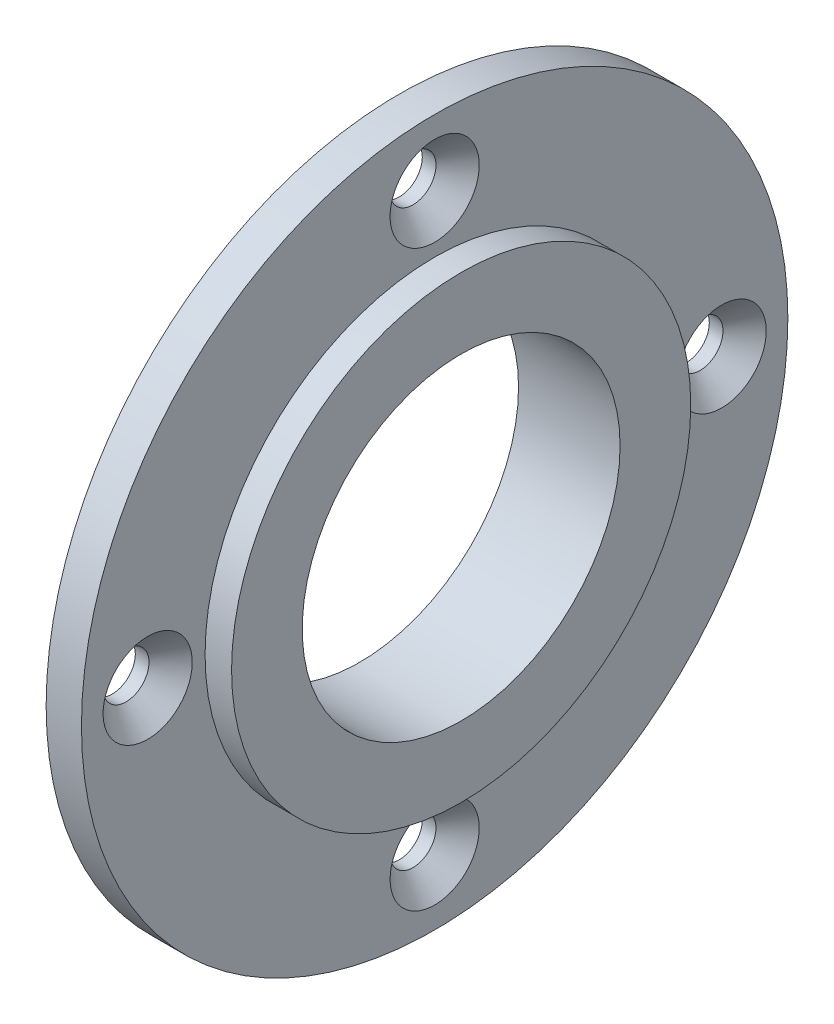
ISO-10303-21;
HEADER;
FILE_DESCRIPTION(('STEP AP214'),'2;1');
FILE_NAME('part.step','',(''),(''),'','','');
FILE_SCHEMA(('AUTOMOTIVE_DESIGN { 1 0 10303 214 1 1 1 1 }'));
ENDSEC;
DATA;
#1=APPLICATION_CONTEXT('core data for automotive mechanical design processes');
#2=APPLICATION_PROTOCOL_DEFINITION('international standard','automotive_design',2000,#1);
#3=PRODUCT_CONTEXT('',#1,'mechanical');
#4=PRODUCT('Part','Part','',(#3));
#5=PRODUCT_RELATED_PRODUCT_CATEGORY('part','',(#4));
#6=PRODUCT_DEFINITION_FORMATION('','',#4);
#7=PRODUCT_DEFINITION_CONTEXT('part definition',#1,'design');
#8=PRODUCT_DEFINITION('design','',#6,#7);
#9=PRODUCT_DEFINITION_SHAPE('','',#8);
#10=(LENGTH_UNIT() NAMED_UNIT(*) SI_UNIT(.MILLI.,.METRE.));
#11=(NAMED_UNIT(*) PLANE_ANGLE_UNIT() SI_UNIT($,.RADIAN.));
#12=(NAMED_UNIT(*) SI_UNIT($,.STERADIAN.) SOLID_ANGLE_UNIT());
#13=UNCERTAINTY_MEASURE_WITH_UNIT(LENGTH_MEASURE(1.E-05),#10,'distance_accuracy_value','');
#14=(GEOMETRIC_REPRESENTATION_CONTEXT(3) GLOBAL_UNCERTAINTY_ASSIGNED_CONTEXT((#13)) GLOBAL_UNIT_ASSIGNED_CONTEXT((#10,
#11,#12)) REPRESENTATION_CONTEXT('',''));
#15=CARTESIAN_POINT('',(0.,0.,0.));
#16=DIRECTION('',(0.,0.,1.));
#17=DIRECTION('',(1.,0.,0.));
#18=AXIS2_PLACEMENT_3D('',#15,#16,#17);
#19=CARTESIAN_POINT('',(-174.905599098805,18.,0.));
#20=DIRECTION('',(1.,0.,0.));
#21=DIRECTION('',(0.,0.,-1.));
#22=AXIS2_PLACEMENT_3D('',#19,#20,#21);
#23=PLANE('',#22);
#24=CARTESIAN_POINT('',(-174.905599098805,0.,0.));
#25=DIRECTION('',(1.,0.,0.));
#26=DIRECTION('',(0.,0.,-1.));
#27=AXIS2_PLACEMENT_3D('',#24,#25,#26);
#28=CIRCLE('',#27,26.);
#29=CARTESIAN_POINT('',(-174.905599098805,0.,-26.));
#30=VERTEX_POINT('',#29);
#31=EDGE_CURVE('E12',#30,#30,#28,.T.);
#32=ORIENTED_EDGE('',*,*,#31,.T.);
#33=EDGE_LOOP('',(#32));
#34=FACE_BOUND('',#33,.T.);
#35=CARTESIAN_POINT('',(-174.905599098805,0.,0.));
#36=DIRECTION('',(1.,0.,0.));
#37=DIRECTION('',(0.,0.,-1.));
#38=AXIS2_PLACEMENT_3D('',#35,#36,#37);
#39=CIRCLE('',#38,18.);
#40=CARTESIAN_POINT('',(-174.905599098805,0.,-18.));
#41=VERTEX_POINT('',#40);
#42=EDGE_CURVE('E72',#41,#41,#39,.T.);
#43=ORIENTED_EDGE('',*,*,#42,.F.);
#44=EDGE_LOOP('',(#43));
#45=FACE_BOUND('',#44,.T.);
#46=ADVANCED_FACE('F44',(#34,#45),#23,.T.);
#47=CARTESIAN_POINT('',(0.,0.,0.));
#48=DIRECTION('',(1.,0.,0.));
#49=DIRECTION('',(0.,0.,-1.));
#50=AXIS2_PLACEMENT_3D('',#47,#48,#49);
#51=CYLINDRICAL_SURFACE('',#50,26.);
#52=CARTESIAN_POINT('',(-177.905599098805,0.,0.));
#53=DIRECTION('',(1.,0.,0.));
#54=DIRECTION('',(0.,0.,-1.));
#55=AXIS2_PLACEMENT_3D('',#52,#53,#54);
#56=CIRCLE('',#55,26.);
#57=CARTESIAN_POINT('',(-177.905599098805,0.,-26.));
#58=VERTEX_POINT('',#57);
#59=EDGE_CURVE('E51',#58,#58,#56,.T.);
#60=ORIENTED_EDGE('',*,*,#59,.T.);
#61=EDGE_LOOP('',(#60));
#62=FACE_BOUND('',#61,.T.);
#63=ORIENTED_EDGE('',*,*,#31,.F.);
#64=EDGE_LOOP('',(#63));
#65=FACE_BOUND('',#64,.T.);
#66=ADVANCED_FACE('F115',(#62,#65),#51,.T.);
#67=CARTESIAN_POINT('',(-177.905599098805,26.,0.));
#68=DIRECTION('',(1.,0.,0.));
#69=DIRECTION('',(0.,0.,-1.));
#70=AXIS2_PLACEMENT_3D('',#67,#68,#69);
#71=PLANE('',#70);
#72=CARTESIAN_POINT('',(-177.905599098805,-1.13473143512402E-13,32.5));
#73=DIRECTION('',(1.,0.,0.));
#74=DIRECTION('',(0.,1.,0.));
#75=AXIS2_PLACEMENT_3D('',#72,#73,#74);
#76=CIRCLE('',#75,5.05);
#77=CARTESIAN_POINT('',(-177.905599098805,5.04999999999989,32.5));
#78=VERTEX_POINT('',#77);
#79=EDGE_CURVE('E95',#78,#78,#76,.T.);
#80=ORIENTED_EDGE('',*,*,#79,.F.);
#81=EDGE_LOOP('',(#80));
#82=FACE_BOUND('',#81,.T.);
#83=CARTESIAN_POINT('',(-177.905599098805,-32.5,0.));
#84=DIRECTION('',(1.,0.,0.));
#85=DIRECTION('',(0.,0.,1.));
#86=AXIS2_PLACEMENT_3D('',#83,#84,#85);
#87=CIRCLE('',#86,5.05);
#88=CARTESIAN_POINT('',(-177.905599098805,-32.5,5.05));
#89=VERTEX_POINT('',#88);
#90=EDGE_CURVE('E85',#89,#89,#87,.T.);
#91=ORIENTED_EDGE('',*,*,#90,.F.);
#92=EDGE_LOOP('',(#91));
#93=FACE_BOUND('',#92,.T.);
#94=CARTESIAN_POINT('',(-177.905599098805,3.40419430537206E-13,-32.5));
#95=DIRECTION('',(1.,0.,0.));
#96=DIRECTION('',(0.,-1.,0.));
#97=AXIS2_PLACEMENT_3D('',#94,#95,#96);
#98=CIRCLE('',#97,5.05);
#99=CARTESIAN_POINT('',(-177.905599098805,-5.04999999999966,-32.5000000000001));
#100=VERTEX_POINT('',#99);
#101=EDGE_CURVE('E89',#100,#100,#98,.T.);
#102=ORIENTED_EDGE('',*,*,#101,.F.);
#103=EDGE_LOOP('',(#102));
#104=FACE_BOUND('',#103,.T.);
#105=CARTESIAN_POINT('',(-177.905599098805,32.5,0.));
#106=DIRECTION('',(1.,0.,0.));
#107=DIRECTION('',(0.,0.,-1.));
#108=AXIS2_PLACEMENT_3D('',#105,#106,#107);
#109=CIRCLE('',#108,5.05);
#110=CARTESIAN_POINT('',(-177.905599098805,32.5,-5.05));
#111=VERTEX_POINT('',#110);
#112=EDGE_CURVE('E78',#111,#111,#109,.T.);
#113=ORIENTED_EDGE('',*,*,#112,.F.);
#114=EDGE_LOOP('',(#113));
#115=FACE_BOUND('',#114,.T.);
#116=CARTESIAN_POINT('',(-177.905599098805,0.,0.));
#117=DIRECTION('',(1.,0.,0.));
#118=DIRECTION('',(0.,0.,-1.));
#119=AXIS2_PLACEMENT_3D('',#116,#117,#118);
#120=CIRCLE('',#119,40.);
#121=CARTESIAN_POINT('',(-177.905599098805,0.,-40.));
#122=VERTEX_POINT('',#121);
#123=EDGE_CURVE('E55',#122,#122,#120,.T.);
#124=ORIENTED_EDGE('',*,*,#123,.T.);
#125=EDGE_LOOP('',(#124));
#126=FACE_BOUND('',#125,.T.);
#127=ORIENTED_EDGE('',*,*,#59,.F.);
#128=EDGE_LOOP('',(#127));
#129=FACE_BOUND('',#128,.T.);
#130=ADVANCED_FACE('F111',(#82,#93,#104,#115,#126,#129),#71,.T.);
#131=CARTESIAN_POINT('',(0.,0.,0.));
#132=DIRECTION('',(1.,0.,0.));
#133=DIRECTION('',(0.,0.,-1.));
#134=AXIS2_PLACEMENT_3D('',#131,#132,#133);
#135=CYLINDRICAL_SURFACE('',#134,40.);
#136=CARTESIAN_POINT('',(-181.905599098805,0.,0.));
#137=DIRECTION('',(1.,0.,0.));
#138=DIRECTION('',(0.,0.,-1.));
#139=AXIS2_PLACEMENT_3D('',#136,#137,#138);
#140=CIRCLE('',#139,40.);
#141=CARTESIAN_POINT('',(-181.905599098805,0.,-40.));
#142=VERTEX_POINT('',#141);
#143=EDGE_CURVE('E60',#142,#142,#140,.T.);
#144=ORIENTED_EDGE('',*,*,#143,.T.);
#145=EDGE_LOOP('',(#144));
#146=FACE_BOUND('',#145,.T.);
#147=ORIENTED_EDGE('',*,*,#123,.F.);
#148=EDGE_LOOP('',(#147));
#149=FACE_BOUND('',#148,.T.);
#150=ADVANCED_FACE('F114',(#146,#149),#135,.T.);
#151=CARTESIAN_POINT('',(-181.905599098805,40.,0.));
#152=DIRECTION('',(-1.,0.,0.));
#153=DIRECTION('',(0.,0.,1.));
#154=AXIS2_PLACEMENT_3D('',#151,#152,#153);
#155=PLANE('',#154);
#156=CARTESIAN_POINT('',(-181.905599098805,-1.13473143512402E-13,32.5));
#157=DIRECTION('',(-1.,0.,0.));
#158=DIRECTION('',(0.,-1.,0.));
#159=AXIS2_PLACEMENT_3D('',#156,#157,#158);
#160=CIRCLE('',#159,2.6);
#161=CARTESIAN_POINT('',(-181.905599098805,-2.60000000000011,32.5));
#162=VERTEX_POINT('',#161);
#163=EDGE_CURVE('E103',#162,#162,#160,.T.);
#164=ORIENTED_EDGE('',*,*,#163,.F.);
#165=EDGE_LOOP('',(#164));
#166=FACE_BOUND('',#165,.T.);
#167=CARTESIAN_POINT('',(-181.905599098805,-32.5,0.));
#168=DIRECTION('',(-1.,0.,0.));
#169=DIRECTION('',(0.,0.,-1.));
#170=AXIS2_PLACEMENT_3D('',#167,#168,#169);
#171=CIRCLE('',#170,2.6);
#172=CARTESIAN_POINT('',(-181.905599098805,-32.5,-2.6));
#173=VERTEX_POINT('',#172);
#174=EDGE_CURVE('E96',#173,#173,#171,.T.);
#175=ORIENTED_EDGE('',*,*,#174,.F.);
#176=EDGE_LOOP('',(#175));
#177=FACE_BOUND('',#176,.T.);
#178=CARTESIAN_POINT('',(-181.905599098805,3.40419430537206E-13,-32.5));
#179=DIRECTION('',(-1.,0.,0.));
#180=DIRECTION('',(0.,1.,0.));
#181=AXIS2_PLACEMENT_3D('',#178,#179,#180);
#182=CIRCLE('',#181,2.6);
#183=CARTESIAN_POINT('',(-181.905599098805,2.60000000000034,-32.5));
#184=VERTEX_POINT('',#183);
#185=EDGE_CURVE('E86',#184,#184,#182,.T.);
#186=ORIENTED_EDGE('',*,*,#185,.F.);
#187=EDGE_LOOP('',(#186));
#188=FACE_BOUND('',#187,.T.);
#189=CARTESIAN_POINT('',(-181.905599098805,32.5,0.));
#190=DIRECTION('',(-1.,0.,0.));
#191=DIRECTION('',(0.,0.,1.));
#192=AXIS2_PLACEMENT_3D('',#189,#190,#191);
#193=CIRCLE('',#192,2.6);
#194=CARTESIAN_POINT('',(-181.905599098805,32.5,2.6));
#195=VERTEX_POINT('',#194);
#196=EDGE_CURVE('E47',#195,#195,#193,.T.);
#197=ORIENTED_EDGE('',*,*,#196,.F.);
#198=EDGE_LOOP('',(#197));
#199=FACE_BOUND('',#198,.T.);
#200=CARTESIAN_POINT('',(-181.905599098805,0.,0.));
#201=DIRECTION('',(1.,0.,0.));
#202=DIRECTION('',(0.,0.,-1.));
#203=AXIS2_PLACEMENT_3D('',#200,#201,#202);
#204=CIRCLE('',#203,21.);
#205=CARTESIAN_POINT('',(-181.905599098805,0.,-21.));
#206=VERTEX_POINT('',#205);
#207=EDGE_CURVE('E63',#206,#206,#204,.T.);
#208=ORIENTED_EDGE('',*,*,#207,.T.);
#209=EDGE_LOOP('',(#208));
#210=FACE_BOUND('',#209,.T.);
#211=ORIENTED_EDGE('',*,*,#143,.F.);
#212=EDGE_LOOP('',(#211));
#213=FACE_BOUND('',#212,.T.);
#214=ADVANCED_FACE('F135',(#166,#177,#188,#199,#210,#213),#155,.T.);
#215=CARTESIAN_POINT('',(0.,0.,0.));
#216=DIRECTION('',(1.,0.,0.));
#217=DIRECTION('',(0.,0.,-1.));
#218=AXIS2_PLACEMENT_3D('',#215,#216,#217);
#219=CYLINDRICAL_SURFACE('',#218,21.);
#220=CARTESIAN_POINT('',(-186.405599098805,0.,0.));
#221=DIRECTION('',(1.,0.,0.));
#222=DIRECTION('',(0.,0.,-1.));
#223=AXIS2_PLACEMENT_3D('',#220,#221,#222);
#224=CIRCLE('',#223,21.);
#225=CARTESIAN_POINT('',(-186.405599098805,0.,-21.));
#226=VERTEX_POINT('',#225);
#227=EDGE_CURVE('E66',#226,#226,#224,.T.);
#228=ORIENTED_EDGE('',*,*,#227,.T.);
#229=EDGE_LOOP('',(#228));
#230=FACE_BOUND('',#229,.T.);
#231=ORIENTED_EDGE('',*,*,#207,.F.);
#232=EDGE_LOOP('',(#231));
#233=FACE_BOUND('',#232,.T.);
#234=ADVANCED_FACE('F139',(#230,#233),#219,.T.);
#235=CARTESIAN_POINT('',(-186.405599098805,21.,0.));
#236=DIRECTION('',(-1.,0.,0.));
#237=DIRECTION('',(0.,0.,1.));
#238=AXIS2_PLACEMENT_3D('',#235,#236,#237);
#239=PLANE('',#238);
#240=CARTESIAN_POINT('',(-186.405599098805,0.,0.));
#241=DIRECTION('',(1.,0.,0.));
#242=DIRECTION('',(0.,0.,-1.));
#243=AXIS2_PLACEMENT_3D('',#240,#241,#242);
#244=CIRCLE('',#243,18.);
#245=CARTESIAN_POINT('',(-186.405599098805,0.,-18.));
#246=VERTEX_POINT('',#245);
#247=EDGE_CURVE('E69',#246,#246,#244,.T.);
#248=ORIENTED_EDGE('',*,*,#247,.T.);
#249=EDGE_LOOP('',(#248));
#250=FACE_BOUND('',#249,.T.);
#251=ORIENTED_EDGE('',*,*,#227,.F.);
#252=EDGE_LOOP('',(#251));
#253=FACE_BOUND('',#252,.T.);
#254=ADVANCED_FACE('F143',(#250,#253),#239,.T.);
#255=CARTESIAN_POINT('',(0.,0.,0.));
#256=DIRECTION('',(1.,0.,0.));
#257=DIRECTION('',(0.,0.,-1.));
#258=AXIS2_PLACEMENT_3D('',#255,#256,#257);
#259=CYLINDRICAL_SURFACE('',#258,18.);
#260=ORIENTED_EDGE('',*,*,#42,.T.);
#261=EDGE_LOOP('',(#260));
#262=FACE_BOUND('',#261,.T.);
#263=ORIENTED_EDGE('',*,*,#247,.F.);
#264=EDGE_LOOP('',(#263));
#265=FACE_BOUND('',#264,.T.);
#266=ADVANCED_FACE('F147',(#262,#265),#259,.F.);
#267=CARTESIAN_POINT('',(-177.905599098805,32.5,0.));
#268=DIRECTION('',(1.,0.,0.));
#269=DIRECTION('',(0.,0.,-1.));
#270=AXIS2_PLACEMENT_3D('',#267,#268,#269);
#271=CYLINDRICAL_SURFACE('',#270,2.6);
#272=ORIENTED_EDGE('',*,*,#196,.T.);
#273=EDGE_LOOP('',(#272));
#274=FACE_BOUND('',#273,.T.);
#275=CARTESIAN_POINT('',(-180.355599098805,32.5,0.));
#276=DIRECTION('',(1.,0.,0.));
#277=DIRECTION('',(0.,0.,-1.));
#278=AXIS2_PLACEMENT_3D('',#275,#276,#277);
#279=CIRCLE('',#278,2.6);
#280=CARTESIAN_POINT('',(-180.355599098805,32.5,-2.6));
#281=VERTEX_POINT('',#280);
#282=EDGE_CURVE('E75',#281,#281,#279,.T.);
#283=ORIENTED_EDGE('',*,*,#282,.T.);
#284=EDGE_LOOP('',(#283));
#285=FACE_BOUND('',#284,.T.);
#286=ADVANCED_FACE('F151',(#274,#285),#271,.F.);
#287=CARTESIAN_POINT('',(-177.905599098805,32.5,0.));
#288=DIRECTION('',(1.,0.,0.));
#289=DIRECTION('',(0.,0.,-1.));
#290=AXIS2_PLACEMENT_3D('',#287,#288,#289);
#291=CONICAL_SURFACE('',#290,5.05,0.785398163397447);
#292=ORIENTED_EDGE('',*,*,#282,.F.);
#293=EDGE_LOOP('',(#292));
#294=FACE_BOUND('',#293,.T.);
#295=ORIENTED_EDGE('',*,*,#112,.T.);
#296=EDGE_LOOP('',(#295));
#297=FACE_BOUND('',#296,.T.);
#298=ADVANCED_FACE('F155',(#294,#297),#291,.F.);
#299=CARTESIAN_POINT('',(-177.905599098805,3.40419430537206E-13,-32.5));
#300=DIRECTION('',(1.,0.,0.));
#301=DIRECTION('',(0.,-1.,0.));
#302=AXIS2_PLACEMENT_3D('',#299,#300,#301);
#303=CYLINDRICAL_SURFACE('',#302,2.6);
#304=ORIENTED_EDGE('',*,*,#185,.T.);
#305=EDGE_LOOP('',(#304));
#306=FACE_BOUND('',#305,.T.);
#307=CARTESIAN_POINT('',(-180.355599098805,3.40419430537206E-13,-32.5));
#308=DIRECTION('',(1.,0.,0.));
#309=DIRECTION('',(0.,-1.,0.));
#310=AXIS2_PLACEMENT_3D('',#307,#308,#309);
#311=CIRCLE('',#310,2.6);
#312=CARTESIAN_POINT('',(-180.355599098805,-2.59999999999966,-32.5));
#313=VERTEX_POINT('',#312);
#314=EDGE_CURVE('E82',#313,#313,#311,.T.);
#315=ORIENTED_EDGE('',*,*,#314,.T.);
#316=EDGE_LOOP('',(#315));
#317=FACE_BOUND('',#316,.T.);
#318=ADVANCED_FACE('F159',(#306,#317),#303,.F.);
#319=CARTESIAN_POINT('',(-177.905599098805,3.40419430537206E-13,-32.5));
#320=DIRECTION('',(1.,0.,0.));
#321=DIRECTION('',(0.,-1.,0.));
#322=AXIS2_PLACEMENT_3D('',#319,#320,#321);
#323=CONICAL_SURFACE('',#322,5.05,0.785398163397447);
#324=ORIENTED_EDGE('',*,*,#314,.F.);
#325=EDGE_LOOP('',(#324));
#326=FACE_BOUND('',#325,.T.);
#327=ORIENTED_EDGE('',*,*,#101,.T.);
#328=EDGE_LOOP('',(#327));
#329=FACE_BOUND('',#328,.T.);
#330=ADVANCED_FACE('F163',(#326,#329),#323,.F.);
#331=CARTESIAN_POINT('',(-177.905599098805,-32.5,0.));
#332=DIRECTION('',(1.,0.,0.));
#333=DIRECTION('',(0.,0.,1.));
#334=AXIS2_PLACEMENT_3D('',#331,#332,#333);
#335=CYLINDRICAL_SURFACE('',#334,2.6);
#336=ORIENTED_EDGE('',*,*,#174,.T.);
#337=EDGE_LOOP('',(#336));
#338=FACE_BOUND('',#337,.T.);
#339=CARTESIAN_POINT('',(-180.355599098805,-32.5,0.));
#340=DIRECTION('',(1.,0.,0.));
#341=DIRECTION('',(0.,0.,1.));
#342=AXIS2_PLACEMENT_3D('',#339,#340,#341);
#343=CIRCLE('',#342,2.6);
#344=CARTESIAN_POINT('',(-180.355599098805,-32.5,2.6));
#345=VERTEX_POINT('',#344);
#346=EDGE_CURVE('E92',#345,#345,#343,.T.);
#347=ORIENTED_EDGE('',*,*,#346,.T.);
#348=EDGE_LOOP('',(#347));
#349=FACE_BOUND('',#348,.T.);
#350=ADVANCED_FACE('F167',(#338,#349),#335,.F.);
#351=CARTESIAN_POINT('',(-177.905599098805,-32.5,0.));
#352=DIRECTION('',(1.,0.,0.));
#353=DIRECTION('',(0.,0.,1.));
#354=AXIS2_PLACEMENT_3D('',#351,#352,#353);
#355=CONICAL_SURFACE('',#354,5.05,0.785398163397447);
#356=ORIENTED_EDGE('',*,*,#346,.F.);
#357=EDGE_LOOP('',(#356));
#358=FACE_BOUND('',#357,.T.);
#359=ORIENTED_EDGE('',*,*,#90,.T.);
#360=EDGE_LOOP('',(#359));
#361=FACE_BOUND('',#360,.T.);
#362=ADVANCED_FACE('F171',(#358,#361),#355,.F.);
#363=CARTESIAN_POINT('',(-177.905599098805,-1.13473143512402E-13,32.5));
#364=DIRECTION('',(1.,0.,0.));
#365=DIRECTION('',(0.,1.,0.));
#366=AXIS2_PLACEMENT_3D('',#363,#364,#365);
#367=CYLINDRICAL_SURFACE('',#366,2.6);
#368=ORIENTED_EDGE('',*,*,#163,.T.);
#369=EDGE_LOOP('',(#368));
#370=FACE_BOUND('',#369,.T.);
#371=CARTESIAN_POINT('',(-180.355599098805,-1.13473143512402E-13,32.5));
#372=DIRECTION('',(1.,0.,0.));
#373=DIRECTION('',(0.,1.,0.));
#374=AXIS2_PLACEMENT_3D('',#371,#372,#373);
#375=CIRCLE('',#374,2.6);
#376=CARTESIAN_POINT('',(-180.355599098805,2.59999999999988,32.5));
#377=VERTEX_POINT('',#376);
#378=EDGE_CURVE('E81',#377,#377,#375,.T.);
#379=ORIENTED_EDGE('',*,*,#378,.T.);
#380=EDGE_LOOP('',(#379));
#381=FACE_BOUND('',#380,.T.);
#382=ADVANCED_FACE('F175',(#370,#381),#367,.F.);
#383=CARTESIAN_POINT('',(-177.905599098805,-1.13473143512402E-13,32.5));
#384=DIRECTION('',(1.,0.,0.));
#385=DIRECTION('',(0.,1.,0.));
#386=AXIS2_PLACEMENT_3D('',#383,#384,#385);
#387=CONICAL_SURFACE('',#386,5.05,0.785398163397447);
#388=ORIENTED_EDGE('',*,*,#378,.F.);
#389=EDGE_LOOP('',(#388));
#390=FACE_BOUND('',#389,.T.);
#391=ORIENTED_EDGE('',*,*,#79,.T.);
#392=EDGE_LOOP('',(#391));
#393=FACE_BOUND('',#392,.T.);
#394=ADVANCED_FACE('F109',(#390,#393),#387,.F.);
#395=CLOSED_SHELL('',(#46,#66,#130,#150,#214,#234,#254,#266,#286,#298,#318,#330,#350,#362,#382,#394));
#396=MANIFOLD_SOLID_BREP('B2',#395);
#397=ADVANCED_BREP_SHAPE_REPRESENTATION('',(#18,#396),#14);
#398=SHAPE_DEFINITION_REPRESENTATION(#9,#397);
ENDSEC;
END-ISO-10303-21;
